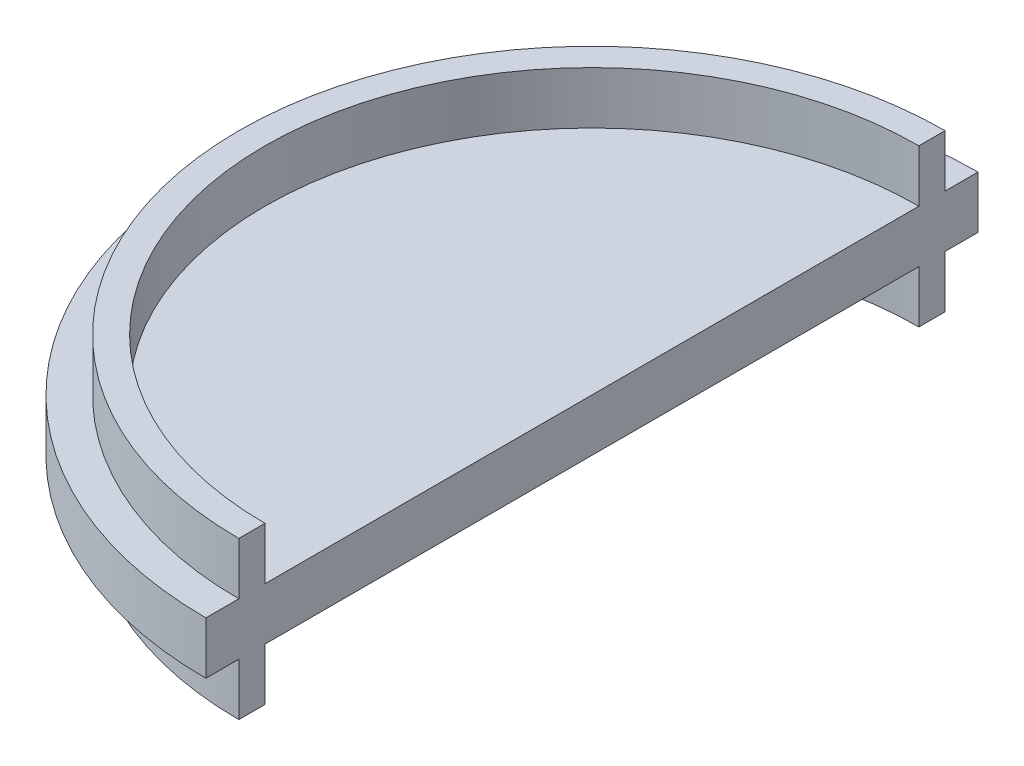
ISO-10303-21;
HEADER;
FILE_DESCRIPTION(('STEP AP214'),'2;1');
FILE_NAME('part.step','',(''),(''),'','','');
FILE_SCHEMA(('AUTOMOTIVE_DESIGN { 1 0 10303 214 1 1 1 1 }'));
ENDSEC;
DATA;
#1=APPLICATION_CONTEXT('core data for automotive mechanical design processes');
#2=APPLICATION_PROTOCOL_DEFINITION('international standard','automotive_design',2000,#1);
#3=PRODUCT_CONTEXT('',#1,'mechanical');
#4=PRODUCT('Part','Part','',(#3));
#5=PRODUCT_RELATED_PRODUCT_CATEGORY('part','',(#4));
#6=PRODUCT_DEFINITION_FORMATION('','',#4);
#7=PRODUCT_DEFINITION_CONTEXT('part definition',#1,'design');
#8=PRODUCT_DEFINITION('design','',#6,#7);
#9=PRODUCT_DEFINITION_SHAPE('','',#8);
#10=(LENGTH_UNIT() NAMED_UNIT(*) SI_UNIT(.MILLI.,.METRE.));
#11=(NAMED_UNIT(*) PLANE_ANGLE_UNIT() SI_UNIT($,.RADIAN.));
#12=(NAMED_UNIT(*) SI_UNIT($,.STERADIAN.) SOLID_ANGLE_UNIT());
#13=UNCERTAINTY_MEASURE_WITH_UNIT(LENGTH_MEASURE(1.E-05),#10,'distance_accuracy_value','');
#14=(GEOMETRIC_REPRESENTATION_CONTEXT(3) GLOBAL_UNCERTAINTY_ASSIGNED_CONTEXT((#13)) GLOBAL_UNIT_ASSIGNED_CONTEXT((#10,
#11,#12)) REPRESENTATION_CONTEXT('',''));
#15=CARTESIAN_POINT('',(0.,0.,0.));
#16=DIRECTION('',(0.,0.,1.));
#17=DIRECTION('',(1.,0.,0.));
#18=AXIS2_PLACEMENT_3D('',#15,#16,#17);
#19=CARTESIAN_POINT('',(0.,0.,0.));
#20=DIRECTION('',(1.,0.,0.));
#21=DIRECTION('',(0.,0.,-1.));
#22=AXIS2_PLACEMENT_3D('',#19,#20,#21);
#23=PLANE('',#22);
#24=DIRECTION('',(0.,0.,-1.));
#25=VECTOR('',#24,1.);
#26=CARTESIAN_POINT('',(0.,6.35,0.));
#27=LINE('',#26,#25);
#28=CARTESIAN_POINT('',(0.,6.35,79.375));
#29=VERTEX_POINT('',#28);
#30=CARTESIAN_POINT('',(0.,6.35,-79.375));
#31=VERTEX_POINT('',#30);
#32=EDGE_CURVE('E239',#29,#31,#27,.T.);
#33=ORIENTED_EDGE('',*,*,#32,.F.);
#34=DIRECTION('',(0.,-1.,0.));
#35=VECTOR('',#34,1.);
#36=CARTESIAN_POINT('',(0.,19.05,79.375));
#37=LINE('',#36,#35);
#38=CARTESIAN_POINT('',(0.,19.05,79.375));
#39=VERTEX_POINT('',#38);
#40=EDGE_CURVE('E195',#39,#29,#37,.T.);
#41=ORIENTED_EDGE('',*,*,#40,.F.);
#42=DIRECTION('',(0.,0.,-1.));
#43=VECTOR('',#42,1.);
#44=CARTESIAN_POINT('',(0.,19.05,0.));
#45=LINE('',#44,#43);
#46=CARTESIAN_POINT('',(0.,19.05,85.725));
#47=VERTEX_POINT('',#46);
#48=EDGE_CURVE('E196',#47,#39,#45,.T.);
#49=ORIENTED_EDGE('',*,*,#48,.F.);
#50=DIRECTION('',(0.,-1.,0.));
#51=VECTOR('',#50,1.);
#52=CARTESIAN_POINT('',(0.,19.05,85.725));
#53=LINE('',#52,#51);
#54=CARTESIAN_POINT('',(0.,6.35,85.725));
#55=VERTEX_POINT('',#54);
#56=EDGE_CURVE('E173',#47,#55,#53,.T.);
#57=ORIENTED_EDGE('',*,*,#56,.T.);
#58=DIRECTION('',(0.,0.,-1.));
#59=VECTOR('',#58,1.);
#60=CARTESIAN_POINT('',(0.,6.35,0.));
#61=LINE('',#60,#59);
#62=CARTESIAN_POINT('',(0.,6.35,93.726));
#63=VERTEX_POINT('',#62);
#64=EDGE_CURVE('E203',#63,#55,#61,.T.);
#65=ORIENTED_EDGE('',*,*,#64,.F.);
#66=DIRECTION('',(0.,-1.,0.));
#67=VECTOR('',#66,1.);
#68=CARTESIAN_POINT('',(0.,6.35,93.726));
#69=LINE('',#68,#67);
#70=CARTESIAN_POINT('',(0.,-6.35,93.726));
#71=VERTEX_POINT('',#70);
#72=EDGE_CURVE('E168',#63,#71,#69,.T.);
#73=ORIENTED_EDGE('',*,*,#72,.T.);
#74=DIRECTION('',(0.,0.,-1.));
#75=VECTOR('',#74,1.);
#76=CARTESIAN_POINT('',(0.,-6.35,0.));
#77=LINE('',#76,#75);
#78=CARTESIAN_POINT('',(0.,-6.35,85.725));
#79=VERTEX_POINT('',#78);
#80=EDGE_CURVE('E158',#71,#79,#77,.T.);
#81=ORIENTED_EDGE('',*,*,#80,.T.);
#82=DIRECTION('',(0.,1.,0.));
#83=VECTOR('',#82,1.);
#84=CARTESIAN_POINT('',(0.,-19.05,85.725));
#85=LINE('',#84,#83);
#86=CARTESIAN_POINT('',(0.,-19.05,85.725));
#87=VERTEX_POINT('',#86);
#88=EDGE_CURVE('E164',#87,#79,#85,.T.);
#89=ORIENTED_EDGE('',*,*,#88,.F.);
#90=DIRECTION('',(0.,0.,1.));
#91=VECTOR('',#90,1.);
#92=CARTESIAN_POINT('',(0.,-19.05,0.));
#93=LINE('',#92,#91);
#94=CARTESIAN_POINT('',(0.,-19.05,79.375));
#95=VERTEX_POINT('',#94);
#96=EDGE_CURVE('E55',#95,#87,#93,.T.);
#97=ORIENTED_EDGE('',*,*,#96,.F.);
#98=DIRECTION('',(0.,1.,0.));
#99=VECTOR('',#98,1.);
#100=CARTESIAN_POINT('',(0.,-19.05,79.375));
#101=LINE('',#100,#99);
#102=CARTESIAN_POINT('',(0.,-6.35,79.375));
#103=VERTEX_POINT('',#102);
#104=EDGE_CURVE('E122',#95,#103,#101,.T.);
#105=ORIENTED_EDGE('',*,*,#104,.T.);
#106=DIRECTION('',(0.,0.,-1.));
#107=VECTOR('',#106,1.);
#108=CARTESIAN_POINT('',(0.,-6.35,0.));
#109=LINE('',#108,#107);
#110=CARTESIAN_POINT('',(0.,-6.35,-79.375));
#111=VERTEX_POINT('',#110);
#112=EDGE_CURVE('E129',#103,#111,#109,.T.);
#113=ORIENTED_EDGE('',*,*,#112,.T.);
#114=DIRECTION('',(0.,1.,0.));
#115=VECTOR('',#114,1.);
#116=CARTESIAN_POINT('',(0.,-19.05,-79.375));
#117=LINE('',#116,#115);
#118=CARTESIAN_POINT('',(0.,-19.05,-79.375));
#119=VERTEX_POINT('',#118);
#120=EDGE_CURVE('E123',#111,#119,#117,.F.);
#121=ORIENTED_EDGE('',*,*,#120,.T.);
#122=CARTESIAN_POINT('',(0.,-19.05,-85.725));
#123=VERTEX_POINT('',#122);
#124=EDGE_CURVE('E63',#123,#119,#93,.T.);
#125=ORIENTED_EDGE('',*,*,#124,.F.);
#126=DIRECTION('',(0.,1.,0.));
#127=VECTOR('',#126,1.);
#128=CARTESIAN_POINT('',(0.,-19.05,-85.725));
#129=LINE('',#128,#127);
#130=CARTESIAN_POINT('',(0.,-6.35,-85.725));
#131=VERTEX_POINT('',#130);
#132=EDGE_CURVE('E163',#131,#123,#129,.F.);
#133=ORIENTED_EDGE('',*,*,#132,.F.);
#134=CARTESIAN_POINT('',(0.,-6.35,-93.726));
#135=VERTEX_POINT('',#134);
#136=EDGE_CURVE('E160',#131,#135,#77,.T.);
#137=ORIENTED_EDGE('',*,*,#136,.T.);
#138=DIRECTION('',(0.,-1.,0.));
#139=VECTOR('',#138,1.);
#140=CARTESIAN_POINT('',(0.,6.35,-93.726));
#141=LINE('',#140,#139);
#142=CARTESIAN_POINT('',(0.,6.35,-93.726));
#143=VERTEX_POINT('',#142);
#144=EDGE_CURVE('E169',#135,#143,#141,.F.);
#145=ORIENTED_EDGE('',*,*,#144,.T.);
#146=CARTESIAN_POINT('',(0.,6.35,-85.725));
#147=VERTEX_POINT('',#146);
#148=EDGE_CURVE('E187',#147,#143,#61,.T.);
#149=ORIENTED_EDGE('',*,*,#148,.F.);
#150=DIRECTION('',(0.,-1.,0.));
#151=VECTOR('',#150,1.);
#152=CARTESIAN_POINT('',(0.,19.05,-85.725));
#153=LINE('',#152,#151);
#154=CARTESIAN_POINT('',(0.,19.05,-85.725));
#155=VERTEX_POINT('',#154);
#156=EDGE_CURVE('E178',#147,#155,#153,.F.);
#157=ORIENTED_EDGE('',*,*,#156,.T.);
#158=CARTESIAN_POINT('',(0.,19.05,-79.375));
#159=VERTEX_POINT('',#158);
#160=EDGE_CURVE('E185',#159,#155,#45,.T.);
#161=ORIENTED_EDGE('',*,*,#160,.F.);
#162=DIRECTION('',(0.,-1.,0.));
#163=VECTOR('',#162,1.);
#164=CARTESIAN_POINT('',(0.,19.05,-79.375));
#165=LINE('',#164,#163);
#166=EDGE_CURVE('E199',#31,#159,#165,.F.);
#167=ORIENTED_EDGE('',*,*,#166,.F.);
#168=EDGE_LOOP('',(#33,#41,#49,#57,#65,#73,#81,#89,#97,#105,#113,#121,#125,#133,#137,#145,#149,
#157,#161,#167));
#169=FACE_BOUND('',#168,.T.);
#170=ADVANCED_FACE('F41',(#169),#23,.T.);
#171=CARTESIAN_POINT('',(0.,6.35,0.));
#172=DIRECTION('',(0.,-1.,0.));
#173=DIRECTION('',(0.,0.,-1.));
#174=AXIS2_PLACEMENT_3D('',#171,#172,#173);
#175=CYLINDRICAL_SURFACE('',#174,93.726);
#176=ORIENTED_EDGE('',*,*,#72,.F.);
#177=CARTESIAN_POINT('',(0.,6.35,0.));
#178=DIRECTION('',(0.,1.,0.));
#179=DIRECTION('',(0.,0.,1.));
#180=AXIS2_PLACEMENT_3D('',#177,#178,#179);
#181=CIRCLE('',#180,93.726);
#182=EDGE_CURVE('E137',#143,#63,#181,.T.);
#183=ORIENTED_EDGE('',*,*,#182,.F.);
#184=ORIENTED_EDGE('',*,*,#144,.F.);
#185=CARTESIAN_POINT('',(0.,-6.35,0.));
#186=DIRECTION('',(0.,1.,0.));
#187=DIRECTION('',(0.,0.,1.));
#188=AXIS2_PLACEMENT_3D('',#185,#186,#187);
#189=CIRCLE('',#188,93.726);
#190=EDGE_CURVE('E140',#135,#71,#189,.T.);
#191=ORIENTED_EDGE('',*,*,#190,.T.);
#192=EDGE_LOOP('',(#176,#183,#184,#191));
#193=FACE_BOUND('',#192,.T.);
#194=ADVANCED_FACE('F209',(#193),#175,.T.);
#195=CARTESIAN_POINT('',(0.,6.35,0.));
#196=DIRECTION('',(0.,1.,0.));
#197=DIRECTION('',(0.,0.,1.));
#198=AXIS2_PLACEMENT_3D('',#195,#196,#197);
#199=PLANE('',#198);
#200=ORIENTED_EDGE('',*,*,#182,.T.);
#201=ORIENTED_EDGE('',*,*,#64,.T.);
#202=CARTESIAN_POINT('',(0.,6.35,0.));
#203=DIRECTION('',(0.,1.,0.));
#204=DIRECTION('',(0.,0.,1.));
#205=AXIS2_PLACEMENT_3D('',#202,#203,#204);
#206=CIRCLE('',#205,85.725);
#207=EDGE_CURVE('E144',#147,#55,#206,.T.);
#208=ORIENTED_EDGE('',*,*,#207,.F.);
#209=ORIENTED_EDGE('',*,*,#148,.T.);
#210=EDGE_LOOP('',(#200,#201,#208,#209));
#211=FACE_BOUND('',#210,.T.);
#212=ADVANCED_FACE('F205',(#211),#199,.T.);
#213=CARTESIAN_POINT('',(0.,-6.35,0.));
#214=DIRECTION('',(0.,1.,0.));
#215=DIRECTION('',(0.,0.,1.));
#216=AXIS2_PLACEMENT_3D('',#213,#214,#215);
#217=PLANE('',#216);
#218=ORIENTED_EDGE('',*,*,#80,.F.);
#219=ORIENTED_EDGE('',*,*,#190,.F.);
#220=ORIENTED_EDGE('',*,*,#136,.F.);
#221=CARTESIAN_POINT('',(0.,-6.35,0.));
#222=DIRECTION('',(0.,1.,0.));
#223=DIRECTION('',(0.,0.,1.));
#224=AXIS2_PLACEMENT_3D('',#221,#222,#223);
#225=CIRCLE('',#224,85.725);
#226=EDGE_CURVE('E49',#131,#79,#225,.T.);
#227=ORIENTED_EDGE('',*,*,#226,.T.);
#228=EDGE_LOOP('',(#218,#219,#220,#227));
#229=FACE_BOUND('',#228,.T.);
#230=ADVANCED_FACE('F156',(#229),#217,.F.);
#231=CARTESIAN_POINT('',(0.,19.05,0.));
#232=DIRECTION('',(0.,1.,0.));
#233=DIRECTION('',(0.,0.,1.));
#234=AXIS2_PLACEMENT_3D('',#231,#232,#233);
#235=PLANE('',#234);
#236=CARTESIAN_POINT('',(0.,19.05,0.));
#237=DIRECTION('',(0.,1.,0.));
#238=DIRECTION('',(0.,0.,1.));
#239=AXIS2_PLACEMENT_3D('',#236,#237,#238);
#240=CIRCLE('',#239,85.725);
#241=EDGE_CURVE('E142',#155,#47,#240,.T.);
#242=ORIENTED_EDGE('',*,*,#241,.T.);
#243=ORIENTED_EDGE('',*,*,#48,.T.);
#244=CARTESIAN_POINT('',(0.,19.05,0.));
#245=DIRECTION('',(0.,1.,0.));
#246=DIRECTION('',(0.,0.,1.));
#247=AXIS2_PLACEMENT_3D('',#244,#245,#246);
#248=CIRCLE('',#247,79.375);
#249=EDGE_CURVE('E146',#159,#39,#248,.T.);
#250=ORIENTED_EDGE('',*,*,#249,.F.);
#251=ORIENTED_EDGE('',*,*,#160,.T.);
#252=EDGE_LOOP('',(#242,#243,#250,#251));
#253=FACE_BOUND('',#252,.T.);
#254=ADVANCED_FACE('F194',(#253),#235,.T.);
#255=CARTESIAN_POINT('',(0.,19.05,0.));
#256=DIRECTION('',(0.,-1.,0.));
#257=DIRECTION('',(0.,0.,-1.));
#258=AXIS2_PLACEMENT_3D('',#255,#256,#257);
#259=CYLINDRICAL_SURFACE('',#258,85.725);
#260=ORIENTED_EDGE('',*,*,#56,.F.);
#261=ORIENTED_EDGE('',*,*,#241,.F.);
#262=ORIENTED_EDGE('',*,*,#156,.F.);
#263=ORIENTED_EDGE('',*,*,#207,.T.);
#264=EDGE_LOOP('',(#260,#261,#262,#263));
#265=FACE_BOUND('',#264,.T.);
#266=ADVANCED_FACE('F43',(#265),#259,.T.);
#267=CARTESIAN_POINT('',(0.,19.05,0.));
#268=DIRECTION('',(0.,-1.,0.));
#269=DIRECTION('',(0.,0.,-1.));
#270=AXIS2_PLACEMENT_3D('',#267,#268,#269);
#271=CYLINDRICAL_SURFACE('',#270,79.375);
#272=ORIENTED_EDGE('',*,*,#249,.T.);
#273=ORIENTED_EDGE('',*,*,#40,.T.);
#274=CARTESIAN_POINT('',(0.,6.35,0.));
#275=DIRECTION('',(0.,1.,0.));
#276=DIRECTION('',(0.,0.,1.));
#277=AXIS2_PLACEMENT_3D('',#274,#275,#276);
#278=CIRCLE('',#277,79.375);
#279=EDGE_CURVE('E127',#29,#31,#278,.F.);
#280=ORIENTED_EDGE('',*,*,#279,.T.);
#281=ORIENTED_EDGE('',*,*,#166,.T.);
#282=EDGE_LOOP('',(#272,#273,#280,#281));
#283=FACE_BOUND('',#282,.T.);
#284=ADVANCED_FACE('F230',(#283),#271,.F.);
#285=ORIENTED_EDGE('',*,*,#279,.F.);
#286=ORIENTED_EDGE('',*,*,#32,.T.);
#287=EDGE_LOOP('',(#285,#286));
#288=FACE_BOUND('',#287,.T.);
#289=ADVANCED_FACE('F217',(#288),#199,.T.);
#290=CARTESIAN_POINT('',(0.,-19.05,0.));
#291=DIRECTION('',(0.,1.,0.));
#292=DIRECTION('',(0.,0.,1.));
#293=AXIS2_PLACEMENT_3D('',#290,#291,#292);
#294=CYLINDRICAL_SURFACE('',#293,85.725);
#295=ORIENTED_EDGE('',*,*,#226,.F.);
#296=ORIENTED_EDGE('',*,*,#132,.T.);
#297=CARTESIAN_POINT('',(0.,-19.05,0.));
#298=DIRECTION('',(0.,1.,0.));
#299=DIRECTION('',(0.,0.,1.));
#300=AXIS2_PLACEMENT_3D('',#297,#298,#299);
#301=CIRCLE('',#300,85.725);
#302=EDGE_CURVE('E149',#123,#87,#301,.T.);
#303=ORIENTED_EDGE('',*,*,#302,.T.);
#304=ORIENTED_EDGE('',*,*,#88,.T.);
#305=EDGE_LOOP('',(#295,#296,#303,#304));
#306=FACE_BOUND('',#305,.T.);
#307=ADVANCED_FACE('F162',(#306),#294,.T.);
#308=CARTESIAN_POINT('',(0.,-19.05,0.));
#309=DIRECTION('',(0.,-1.,0.));
#310=DIRECTION('',(0.,0.,1.));
#311=AXIS2_PLACEMENT_3D('',#308,#309,#310);
#312=PLANE('',#311);
#313=ORIENTED_EDGE('',*,*,#302,.F.);
#314=ORIENTED_EDGE('',*,*,#124,.T.);
#315=CARTESIAN_POINT('',(0.,-19.05,0.));
#316=DIRECTION('',(0.,1.,0.));
#317=DIRECTION('',(0.,0.,1.));
#318=AXIS2_PLACEMENT_3D('',#315,#316,#317);
#319=CIRCLE('',#318,79.375);
#320=EDGE_CURVE('E11',#119,#95,#319,.T.);
#321=ORIENTED_EDGE('',*,*,#320,.T.);
#322=ORIENTED_EDGE('',*,*,#96,.T.);
#323=EDGE_LOOP('',(#313,#314,#321,#322));
#324=FACE_BOUND('',#323,.T.);
#325=ADVANCED_FACE('F224',(#324),#312,.T.);
#326=CARTESIAN_POINT('',(0.,-19.05,0.));
#327=DIRECTION('',(0.,1.,0.));
#328=DIRECTION('',(0.,0.,1.));
#329=AXIS2_PLACEMENT_3D('',#326,#327,#328);
#330=CYLINDRICAL_SURFACE('',#329,79.375);
#331=ORIENTED_EDGE('',*,*,#120,.F.);
#332=CARTESIAN_POINT('',(0.,-6.35,0.));
#333=DIRECTION('',(0.,1.,0.));
#334=DIRECTION('',(0.,0.,1.));
#335=AXIS2_PLACEMENT_3D('',#332,#333,#334);
#336=CIRCLE('',#335,79.375);
#337=EDGE_CURVE('E119',#111,#103,#336,.T.);
#338=ORIENTED_EDGE('',*,*,#337,.T.);
#339=ORIENTED_EDGE('',*,*,#104,.F.);
#340=ORIENTED_EDGE('',*,*,#320,.F.);
#341=EDGE_LOOP('',(#331,#338,#339,#340));
#342=FACE_BOUND('',#341,.T.);
#343=ADVANCED_FACE('F121',(#342),#330,.F.);
#344=ORIENTED_EDGE('',*,*,#112,.F.);
#345=ORIENTED_EDGE('',*,*,#337,.F.);
#346=EDGE_LOOP('',(#344,#345));
#347=FACE_BOUND('',#346,.T.);
#348=ADVANCED_FACE('F131',(#347),#217,.F.);
#349=CLOSED_SHELL('',(#170,#194,#212,#230,#254,#266,#284,#289,#307,#325,#343,#348));
#350=MANIFOLD_SOLID_BREP('B2',#349);
#351=ADVANCED_BREP_SHAPE_REPRESENTATION('',(#18,#350),#14);
#352=SHAPE_DEFINITION_REPRESENTATION(#9,#351);
ENDSEC;
END-ISO-10303-21;
